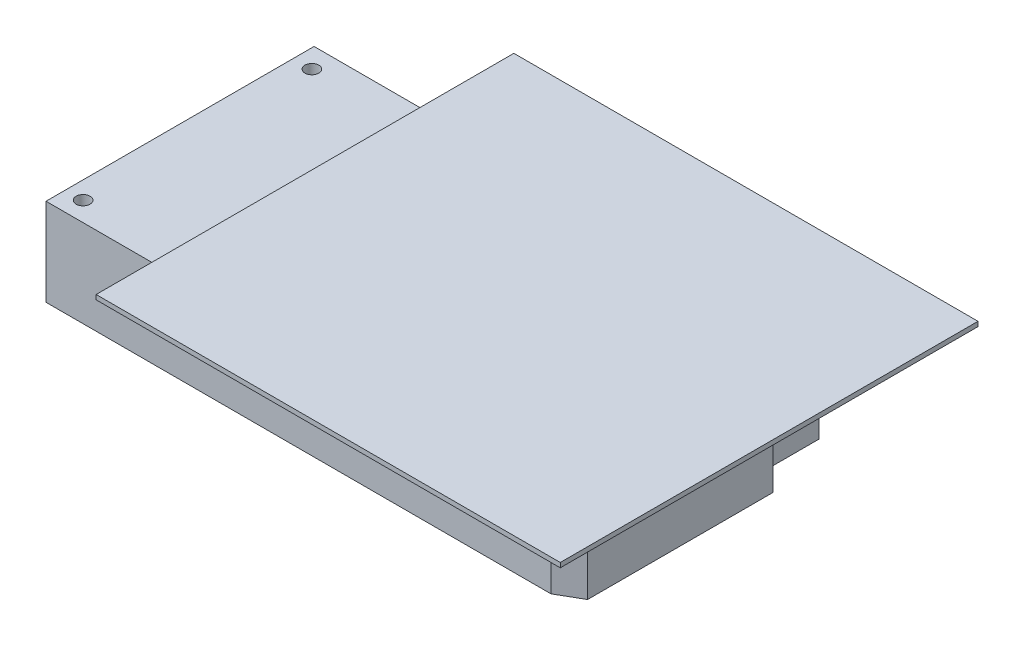
ISO-10303-21;
HEADER;
FILE_DESCRIPTION(('STEP AP214'),'2;1');
FILE_NAME('part.step','',(''),(''),'','','');
FILE_SCHEMA(('AUTOMOTIVE_DESIGN { 1 0 10303 214 1 1 1 1 }'));
ENDSEC;
DATA;
#1=APPLICATION_CONTEXT('core data for automotive mechanical design processes');
#2=APPLICATION_PROTOCOL_DEFINITION('international standard','automotive_design',2000,#1);
#3=PRODUCT_CONTEXT('',#1,'mechanical');
#4=PRODUCT('Part','Part','',(#3));
#5=PRODUCT_RELATED_PRODUCT_CATEGORY('part','',(#4));
#6=PRODUCT_DEFINITION_FORMATION('','',#4);
#7=PRODUCT_DEFINITION_CONTEXT('part definition',#1,'design');
#8=PRODUCT_DEFINITION('design','',#6,#7);
#9=PRODUCT_DEFINITION_SHAPE('','',#8);
#10=(LENGTH_UNIT() NAMED_UNIT(*) SI_UNIT(.MILLI.,.METRE.));
#11=(NAMED_UNIT(*) PLANE_ANGLE_UNIT() SI_UNIT($,.RADIAN.));
#12=(NAMED_UNIT(*) SI_UNIT($,.STERADIAN.) SOLID_ANGLE_UNIT());
#13=UNCERTAINTY_MEASURE_WITH_UNIT(LENGTH_MEASURE(1.E-05),#10,'distance_accuracy_value','');
#14=(GEOMETRIC_REPRESENTATION_CONTEXT(3) GLOBAL_UNCERTAINTY_ASSIGNED_CONTEXT((#13)) GLOBAL_UNIT_ASSIGNED_CONTEXT((#10,
#11,#12)) REPRESENTATION_CONTEXT('',''));
#15=CARTESIAN_POINT('',(0.,0.,0.));
#16=DIRECTION('',(0.,0.,1.));
#17=DIRECTION('',(1.,0.,0.));
#18=AXIS2_PLACEMENT_3D('',#15,#16,#17);
#19=CARTESIAN_POINT('',(0.,18.86,0.));
#20=DIRECTION('',(0.,1.,0.));
#21=DIRECTION('',(0.,0.,1.));
#22=AXIS2_PLACEMENT_3D('',#19,#20,#21);
#23=PLANE('',#22);
#24=DIRECTION('',(0.,0.,1.));
#25=VECTOR('',#24,1.);
#26=CARTESIAN_POINT('',(23.8,18.86,-19.24));
#27=LINE('',#26,#25);
#28=CARTESIAN_POINT('',(23.8,18.86,0.));
#29=VERTEX_POINT('',#28);
#30=CARTESIAN_POINT('',(23.8,18.86,57.7599999999999));
#31=VERTEX_POINT('',#30);
#32=EDGE_CURVE('E11',#29,#31,#27,.T.);
#33=ORIENTED_EDGE('',*,*,#32,.F.);
#34=DIRECTION('',(-1.,0.,0.));
#35=VECTOR('',#34,1.);
#36=CARTESIAN_POINT('',(108.8,18.86,0.));
#37=LINE('',#36,#35);
#38=CARTESIAN_POINT('',(0.,18.86,0.));
#39=VERTEX_POINT('',#38);
#40=EDGE_CURVE('E93',#29,#39,#37,.T.);
#41=ORIENTED_EDGE('',*,*,#40,.T.);
#42=DIRECTION('',(0.,0.,1.));
#43=VECTOR('',#42,1.);
#44=CARTESIAN_POINT('',(0.,18.86,0.));
#45=LINE('',#44,#43);
#46=CARTESIAN_POINT('',(0.,18.86,57.76));
#47=VERTEX_POINT('',#46);
#48=EDGE_CURVE('E168',#39,#47,#45,.T.);
#49=ORIENTED_EDGE('',*,*,#48,.T.);
#50=DIRECTION('',(1.,0.,0.));
#51=VECTOR('',#50,1.);
#52=CARTESIAN_POINT('',(0.,18.86,57.76));
#53=LINE('',#52,#51);
#54=EDGE_CURVE('E134',#47,#31,#53,.T.);
#55=ORIENTED_EDGE('',*,*,#54,.T.);
#56=EDGE_LOOP('',(#33,#41,#49,#55));
#57=FACE_BOUND('',#56,.T.);
#58=CARTESIAN_POINT('',(3.8,18.86,53.57));
#59=DIRECTION('',(0.,1.,0.));
#60=DIRECTION('',(0.,0.,1.));
#61=AXIS2_PLACEMENT_3D('',#58,#59,#60);
#62=CIRCLE('',#61,1.5);
#63=CARTESIAN_POINT('',(3.8,18.86,52.07));
#64=VERTEX_POINT('',#63);
#65=EDGE_CURVE('E199',#64,#64,#62,.T.);
#66=ORIENTED_EDGE('',*,*,#65,.F.);
#67=EDGE_LOOP('',(#66));
#68=FACE_BOUND('',#67,.T.);
#69=CARTESIAN_POINT('',(4.,18.86,4.47));
#70=DIRECTION('',(0.,1.,0.));
#71=DIRECTION('',(0.,0.,1.));
#72=AXIS2_PLACEMENT_3D('',#69,#70,#71);
#73=CIRCLE('',#72,1.5);
#74=CARTESIAN_POINT('',(4.,18.86,2.97));
#75=VERTEX_POINT('',#74);
#76=EDGE_CURVE('E190',#75,#75,#73,.T.);
#77=ORIENTED_EDGE('',*,*,#76,.F.);
#78=EDGE_LOOP('',(#77));
#79=FACE_BOUND('',#78,.T.);
#80=ADVANCED_FACE('F35',(#57,#68,#79),#23,.T.);
#81=CARTESIAN_POINT('',(0.,0.,0.));
#82=DIRECTION('',(0.,1.,0.));
#83=DIRECTION('',(0.,0.,1.));
#84=AXIS2_PLACEMENT_3D('',#81,#82,#83);
#85=PLANE('',#84);
#86=DIRECTION('',(-1.,0.,0.));
#87=VECTOR('',#86,1.);
#88=CARTESIAN_POINT('',(108.8,0.,0.));
#89=LINE('',#88,#87);
#90=CARTESIAN_POINT('',(108.8,0.,0.));
#91=VERTEX_POINT('',#90);
#92=CARTESIAN_POINT('',(0.,0.,0.));
#93=VERTEX_POINT('',#92);
#94=EDGE_CURVE('E139',#91,#93,#89,.T.);
#95=ORIENTED_EDGE('',*,*,#94,.F.);
#96=DIRECTION('',(0.,0.,-1.));
#97=VECTOR('',#96,1.);
#98=CARTESIAN_POINT('',(108.8,0.,12.));
#99=LINE('',#98,#97);
#100=CARTESIAN_POINT('',(108.8,0.,12.));
#101=VERTEX_POINT('',#100);
#102=EDGE_CURVE('E89',#101,#91,#99,.T.);
#103=ORIENTED_EDGE('',*,*,#102,.F.);
#104=DIRECTION('',(-0.86653160609666,0.,-0.499122205111677));
#105=VECTOR('',#104,1.);
#106=CARTESIAN_POINT('',(113.8,0.,14.88));
#107=LINE('',#106,#105);
#108=CARTESIAN_POINT('',(113.8,0.,14.88));
#109=VERTEX_POINT('',#108);
#110=EDGE_CURVE('E150',#109,#101,#107,.T.);
#111=ORIENTED_EDGE('',*,*,#110,.F.);
#112=DIRECTION('',(0.,0.,-1.));
#113=VECTOR('',#112,1.);
#114=CARTESIAN_POINT('',(113.8,0.,54.88));
#115=LINE('',#114,#113);
#116=CARTESIAN_POINT('',(113.8,0.,54.88));
#117=VERTEX_POINT('',#116);
#118=EDGE_CURVE('E116',#117,#109,#115,.T.);
#119=ORIENTED_EDGE('',*,*,#118,.F.);
#120=DIRECTION('',(0.86653160609666,0.,-0.499122205111677));
#121=VECTOR('',#120,1.);
#122=CARTESIAN_POINT('',(108.8,0.,57.76));
#123=LINE('',#122,#121);
#124=CARTESIAN_POINT('',(108.8,0.,57.76));
#125=VERTEX_POINT('',#124);
#126=EDGE_CURVE('E147',#125,#117,#123,.T.);
#127=ORIENTED_EDGE('',*,*,#126,.F.);
#128=DIRECTION('',(1.,0.,0.));
#129=VECTOR('',#128,1.);
#130=CARTESIAN_POINT('',(0.,0.,57.76));
#131=LINE('',#130,#129);
#132=CARTESIAN_POINT('',(0.,0.,57.76));
#133=VERTEX_POINT('',#132);
#134=EDGE_CURVE('E145',#133,#125,#131,.T.);
#135=ORIENTED_EDGE('',*,*,#134,.F.);
#136=DIRECTION('',(0.,0.,1.));
#137=VECTOR('',#136,1.);
#138=CARTESIAN_POINT('',(0.,0.,0.));
#139=LINE('',#138,#137);
#140=EDGE_CURVE('E142',#93,#133,#139,.T.);
#141=ORIENTED_EDGE('',*,*,#140,.F.);
#142=EDGE_LOOP('',(#95,#103,#111,#119,#127,#135,#141));
#143=FACE_BOUND('',#142,.T.);
#144=CARTESIAN_POINT('',(66.5,0.,9.5));
#145=DIRECTION('',(0.,1.,0.));
#146=DIRECTION('',(0.,0.,1.));
#147=AXIS2_PLACEMENT_3D('',#144,#145,#146);
#148=CIRCLE('',#147,1.5);
#149=CARTESIAN_POINT('',(66.5,0.,8.));
#150=VERTEX_POINT('',#149);
#151=EDGE_CURVE('E143',#150,#150,#148,.T.);
#152=ORIENTED_EDGE('',*,*,#151,.T.);
#153=EDGE_LOOP('',(#152));
#154=FACE_BOUND('',#153,.T.);
#155=CARTESIAN_POINT('',(4.,0.,4.47));
#156=DIRECTION('',(0.,1.,0.));
#157=DIRECTION('',(0.,0.,1.));
#158=AXIS2_PLACEMENT_3D('',#155,#156,#157);
#159=CIRCLE('',#158,1.5);
#160=CARTESIAN_POINT('',(4.,0.,2.97));
#161=VERTEX_POINT('',#160);
#162=EDGE_CURVE('E196',#161,#161,#159,.T.);
#163=ORIENTED_EDGE('',*,*,#162,.T.);
#164=EDGE_LOOP('',(#163));
#165=FACE_BOUND('',#164,.T.);
#166=CARTESIAN_POINT('',(3.8,0.,53.57));
#167=DIRECTION('',(0.,1.,0.));
#168=DIRECTION('',(0.,0.,1.));
#169=AXIS2_PLACEMENT_3D('',#166,#167,#168);
#170=CIRCLE('',#169,1.5);
#171=CARTESIAN_POINT('',(3.8,0.,52.07));
#172=VERTEX_POINT('',#171);
#173=EDGE_CURVE('E202',#172,#172,#170,.T.);
#174=ORIENTED_EDGE('',*,*,#173,.T.);
#175=EDGE_LOOP('',(#174));
#176=FACE_BOUND('',#175,.T.);
#177=CARTESIAN_POINT('',(66.5,0.,48.26));
#178=DIRECTION('',(0.,1.,0.));
#179=DIRECTION('',(0.,0.,1.));
#180=AXIS2_PLACEMENT_3D('',#177,#178,#179);
#181=CIRCLE('',#180,1.5);
#182=CARTESIAN_POINT('',(66.5,0.,46.76));
#183=VERTEX_POINT('',#182);
#184=EDGE_CURVE('E194',#183,#183,#181,.T.);
#185=ORIENTED_EDGE('',*,*,#184,.T.);
#186=EDGE_LOOP('',(#185));
#187=FACE_BOUND('',#186,.T.);
#188=ADVANCED_FACE('F172',(#143,#154,#165,#176,#187),#85,.F.);
#189=CARTESIAN_POINT('',(108.8,18.86,0.));
#190=DIRECTION('',(0.,0.,1.));
#191=DIRECTION('',(1.,0.,0.));
#192=AXIS2_PLACEMENT_3D('',#189,#190,#191);
#193=PLANE('',#192);
#194=ORIENTED_EDGE('',*,*,#94,.T.);
#195=DIRECTION('',(0.,-1.,0.));
#196=VECTOR('',#195,1.);
#197=CARTESIAN_POINT('',(0.,18.86,0.));
#198=LINE('',#197,#196);
#199=EDGE_CURVE('E39',#39,#93,#198,.T.);
#200=ORIENTED_EDGE('',*,*,#199,.F.);
#201=ORIENTED_EDGE('',*,*,#40,.F.);
#202=CARTESIAN_POINT('',(108.8,18.86,0.));
#203=VERTEX_POINT('',#202);
#204=EDGE_CURVE('E183',#203,#29,#37,.T.);
#205=ORIENTED_EDGE('',*,*,#204,.F.);
#206=DIRECTION('',(0.,-1.,0.));
#207=VECTOR('',#206,1.);
#208=CARTESIAN_POINT('',(108.8,18.86,0.));
#209=LINE('',#208,#207);
#210=EDGE_CURVE('E60',#203,#91,#209,.T.);
#211=ORIENTED_EDGE('',*,*,#210,.T.);
#212=EDGE_LOOP('',(#194,#200,#201,#205,#211));
#213=FACE_BOUND('',#212,.T.);
#214=ADVANCED_FACE('F37',(#213),#193,.F.);
#215=CARTESIAN_POINT('',(0.,18.86,0.));
#216=DIRECTION('',(1.,0.,0.));
#217=DIRECTION('',(0.,0.,-1.));
#218=AXIS2_PLACEMENT_3D('',#215,#216,#217);
#219=PLANE('',#218);
#220=ORIENTED_EDGE('',*,*,#140,.T.);
#221=DIRECTION('',(0.,-1.,0.));
#222=VECTOR('',#221,1.);
#223=CARTESIAN_POINT('',(0.,18.86,57.76));
#224=LINE('',#223,#222);
#225=EDGE_CURVE('E158',#47,#133,#224,.T.);
#226=ORIENTED_EDGE('',*,*,#225,.F.);
#227=ORIENTED_EDGE('',*,*,#48,.F.);
#228=ORIENTED_EDGE('',*,*,#199,.T.);
#229=EDGE_LOOP('',(#220,#226,#227,#228));
#230=FACE_BOUND('',#229,.T.);
#231=ADVANCED_FACE('F167',(#230),#219,.F.);
#232=CARTESIAN_POINT('',(0.,18.86,57.76));
#233=DIRECTION('',(0.,0.,-1.));
#234=DIRECTION('',(-1.,0.,0.));
#235=AXIS2_PLACEMENT_3D('',#232,#233,#234);
#236=PLANE('',#235);
#237=ORIENTED_EDGE('',*,*,#134,.T.);
#238=DIRECTION('',(0.,-1.,0.));
#239=VECTOR('',#238,1.);
#240=CARTESIAN_POINT('',(108.8,18.86,57.76));
#241=LINE('',#240,#239);
#242=CARTESIAN_POINT('',(108.8,18.86,57.76));
#243=VERTEX_POINT('',#242);
#244=EDGE_CURVE('E156',#243,#125,#241,.T.);
#245=ORIENTED_EDGE('',*,*,#244,.F.);
#246=EDGE_CURVE('E180',#31,#243,#53,.T.);
#247=ORIENTED_EDGE('',*,*,#246,.F.);
#248=ORIENTED_EDGE('',*,*,#54,.F.);
#249=ORIENTED_EDGE('',*,*,#225,.T.);
#250=EDGE_LOOP('',(#237,#245,#247,#248,#249));
#251=FACE_BOUND('',#250,.T.);
#252=ADVANCED_FACE('F175',(#251),#236,.F.);
#253=CARTESIAN_POINT('',(108.8,18.86,57.76));
#254=DIRECTION('',(-0.499122205111677,0.,-0.86653160609666));
#255=DIRECTION('',(-0.86653160609666,0.,0.499122205111677));
#256=AXIS2_PLACEMENT_3D('',#253,#254,#255);
#257=PLANE('',#256);
#258=ORIENTED_EDGE('',*,*,#126,.T.);
#259=DIRECTION('',(0.,-1.,0.));
#260=VECTOR('',#259,1.);
#261=CARTESIAN_POINT('',(113.8,18.86,54.88));
#262=LINE('',#261,#260);
#263=CARTESIAN_POINT('',(113.8,18.86,54.88));
#264=VERTEX_POINT('',#263);
#265=EDGE_CURVE('E119',#264,#117,#262,.T.);
#266=ORIENTED_EDGE('',*,*,#265,.F.);
#267=DIRECTION('',(0.86653160609666,0.,-0.499122205111677));
#268=VECTOR('',#267,1.);
#269=CARTESIAN_POINT('',(108.8,18.86,57.76));
#270=LINE('',#269,#268);
#271=EDGE_CURVE('E132',#243,#264,#270,.T.);
#272=ORIENTED_EDGE('',*,*,#271,.F.);
#273=ORIENTED_EDGE('',*,*,#244,.T.);
#274=EDGE_LOOP('',(#258,#266,#272,#273));
#275=FACE_BOUND('',#274,.T.);
#276=ADVANCED_FACE('F178',(#275),#257,.F.);
#277=CARTESIAN_POINT('',(113.8,18.86,54.88));
#278=DIRECTION('',(-1.,0.,0.));
#279=DIRECTION('',(0.,0.,1.));
#280=AXIS2_PLACEMENT_3D('',#277,#278,#279);
#281=PLANE('',#280);
#282=ORIENTED_EDGE('',*,*,#118,.T.);
#283=DIRECTION('',(0.,-1.,0.));
#284=VECTOR('',#283,1.);
#285=CARTESIAN_POINT('',(113.8,18.86,14.88));
#286=LINE('',#285,#284);
#287=CARTESIAN_POINT('',(113.8,18.86,14.88));
#288=VERTEX_POINT('',#287);
#289=EDGE_CURVE('E108',#288,#109,#286,.T.);
#290=ORIENTED_EDGE('',*,*,#289,.F.);
#291=DIRECTION('',(0.,0.,-1.));
#292=VECTOR('',#291,1.);
#293=CARTESIAN_POINT('',(113.8,18.86,54.88));
#294=LINE('',#293,#292);
#295=EDGE_CURVE('E113',#264,#288,#294,.T.);
#296=ORIENTED_EDGE('',*,*,#295,.F.);
#297=ORIENTED_EDGE('',*,*,#265,.T.);
#298=EDGE_LOOP('',(#282,#290,#296,#297));
#299=FACE_BOUND('',#298,.T.);
#300=ADVANCED_FACE('F110',(#299),#281,.F.);
#301=CARTESIAN_POINT('',(113.8,18.86,14.88));
#302=DIRECTION('',(-0.499122205111677,0.,0.86653160609666));
#303=DIRECTION('',(0.86653160609666,0.,0.499122205111677));
#304=AXIS2_PLACEMENT_3D('',#301,#302,#303);
#305=PLANE('',#304);
#306=ORIENTED_EDGE('',*,*,#110,.T.);
#307=DIRECTION('',(0.,-1.,0.));
#308=VECTOR('',#307,1.);
#309=CARTESIAN_POINT('',(108.8,18.86,12.));
#310=LINE('',#309,#308);
#311=CARTESIAN_POINT('',(108.8,18.86,12.));
#312=VERTEX_POINT('',#311);
#313=EDGE_CURVE('E120',#312,#101,#310,.T.);
#314=ORIENTED_EDGE('',*,*,#313,.F.);
#315=DIRECTION('',(-0.86653160609666,0.,-0.499122205111677));
#316=VECTOR('',#315,1.);
#317=CARTESIAN_POINT('',(113.8,18.86,14.88));
#318=LINE('',#317,#316);
#319=EDGE_CURVE('E123',#288,#312,#318,.T.);
#320=ORIENTED_EDGE('',*,*,#319,.F.);
#321=ORIENTED_EDGE('',*,*,#289,.T.);
#322=EDGE_LOOP('',(#306,#314,#320,#321));
#323=FACE_BOUND('',#322,.T.);
#324=ADVANCED_FACE('F124',(#323),#305,.F.);
#325=CARTESIAN_POINT('',(108.8,18.86,12.));
#326=DIRECTION('',(-1.,0.,0.));
#327=DIRECTION('',(0.,0.,1.));
#328=AXIS2_PLACEMENT_3D('',#325,#326,#327);
#329=PLANE('',#328);
#330=ORIENTED_EDGE('',*,*,#102,.T.);
#331=ORIENTED_EDGE('',*,*,#210,.F.);
#332=DIRECTION('',(0.,0.,-1.));
#333=VECTOR('',#332,1.);
#334=CARTESIAN_POINT('',(108.8,18.86,12.));
#335=LINE('',#334,#333);
#336=EDGE_CURVE('E127',#312,#203,#335,.T.);
#337=ORIENTED_EDGE('',*,*,#336,.F.);
#338=ORIENTED_EDGE('',*,*,#313,.T.);
#339=EDGE_LOOP('',(#330,#331,#337,#338));
#340=FACE_BOUND('',#339,.T.);
#341=ADVANCED_FACE('F275',(#340),#329,.F.);
#342=CARTESIAN_POINT('',(66.5,18.86,9.5));
#343=DIRECTION('',(0.,-1.,0.));
#344=DIRECTION('',(0.,0.,-1.));
#345=AXIS2_PLACEMENT_3D('',#342,#343,#344);
#346=CYLINDRICAL_SURFACE('',#345,1.5);
#347=CARTESIAN_POINT('',(66.5,18.86,9.5));
#348=DIRECTION('',(0.,1.,0.));
#349=DIRECTION('',(0.,0.,1.));
#350=AXIS2_PLACEMENT_3D('',#347,#348,#349);
#351=CIRCLE('',#350,1.5);
#352=CARTESIAN_POINT('',(66.5,18.86,8.));
#353=VERTEX_POINT('',#352);
#354=EDGE_CURVE('E191',#353,#353,#351,.T.);
#355=CARTESIAN_POINT('',(66.5,18.86,8.));
#356=CARTESIAN_POINT('',(66.5,18.6635416666667,8.));
#357=CARTESIAN_POINT('',(66.5,18.4670833333333,8.));
#358=CARTESIAN_POINT('',(66.5,18.0741666666667,8.));
#359=CARTESIAN_POINT('',(66.5,17.8777083333333,8.));
#360=CARTESIAN_POINT('',(66.5,17.4847916666667,8.));
#361=CARTESIAN_POINT('',(66.5,17.2883333333333,8.));
#362=CARTESIAN_POINT('',(66.5,16.8954166666667,8.));
#363=CARTESIAN_POINT('',(66.5,16.6989583333333,8.));
#364=CARTESIAN_POINT('',(66.5,16.3060416666667,8.));
#365=CARTESIAN_POINT('',(66.5,16.1095833333333,8.));
#366=CARTESIAN_POINT('',(66.5,15.7166666666667,8.));
#367=CARTESIAN_POINT('',(66.5,15.5202083333333,8.));
#368=CARTESIAN_POINT('',(66.5,15.1272916666667,8.));
#369=CARTESIAN_POINT('',(66.5,14.9308333333333,8.));
#370=CARTESIAN_POINT('',(66.5,14.5379166666667,8.));
#371=CARTESIAN_POINT('',(66.5,14.3414583333333,8.));
#372=CARTESIAN_POINT('',(66.5,13.9485416666667,8.));
#373=CARTESIAN_POINT('',(66.5,13.7520833333333,8.));
#374=CARTESIAN_POINT('',(66.5,13.3591666666667,8.));
#375=CARTESIAN_POINT('',(66.5,13.1627083333333,8.));
#376=CARTESIAN_POINT('',(66.5,12.7697916666667,8.));
#377=CARTESIAN_POINT('',(66.5,12.5733333333333,8.));
#378=CARTESIAN_POINT('',(66.5,12.1804166666667,8.));
#379=CARTESIAN_POINT('',(66.5,11.9839583333333,8.));
#380=CARTESIAN_POINT('',(66.5,11.5910416666667,8.));
#381=CARTESIAN_POINT('',(66.5,11.3945833333333,8.));
#382=CARTESIAN_POINT('',(66.5,11.0016666666667,8.));
#383=CARTESIAN_POINT('',(66.5,10.8052083333333,8.));
#384=CARTESIAN_POINT('',(66.5,10.4122916666667,8.));
#385=CARTESIAN_POINT('',(66.5,10.2158333333333,8.));
#386=CARTESIAN_POINT('',(66.5,9.82291666666667,8.));
#387=CARTESIAN_POINT('',(66.5,9.62645833333333,8.));
#388=CARTESIAN_POINT('',(66.5,9.23354166666667,8.));
#389=CARTESIAN_POINT('',(66.5,9.03708333333333,8.));
#390=CARTESIAN_POINT('',(66.5,8.64416666666667,8.));
#391=CARTESIAN_POINT('',(66.5,8.44770833333333,8.));
#392=CARTESIAN_POINT('',(66.5,8.05479166666667,8.));
#393=CARTESIAN_POINT('',(66.5,7.85833333333333,8.));
#394=CARTESIAN_POINT('',(66.5,7.46541666666667,8.));
#395=CARTESIAN_POINT('',(66.5,7.26895833333333,8.));
#396=CARTESIAN_POINT('',(66.5,6.87604166666667,8.));
#397=CARTESIAN_POINT('',(66.5,6.67958333333333,8.));
#398=CARTESIAN_POINT('',(66.5,6.28666666666667,8.));
#399=CARTESIAN_POINT('',(66.5,6.09020833333333,8.));
#400=CARTESIAN_POINT('',(66.5,5.69729166666667,8.));
#401=CARTESIAN_POINT('',(66.5,5.50083333333333,8.));
#402=CARTESIAN_POINT('',(66.5,5.10791666666667,8.));
#403=CARTESIAN_POINT('',(66.5,4.91145833333333,8.));
#404=CARTESIAN_POINT('',(66.5,4.51854166666667,8.));
#405=CARTESIAN_POINT('',(66.5,4.32208333333333,8.));
#406=CARTESIAN_POINT('',(66.5,3.92916666666667,8.));
#407=CARTESIAN_POINT('',(66.5,3.73270833333333,8.));
#408=CARTESIAN_POINT('',(66.5,3.33979166666667,8.));
#409=CARTESIAN_POINT('',(66.5,3.14333333333333,8.));
#410=CARTESIAN_POINT('',(66.5,2.75041666666666,8.));
#411=CARTESIAN_POINT('',(66.5,2.55395833333333,8.));
#412=CARTESIAN_POINT('',(66.5,2.16104166666667,8.));
#413=CARTESIAN_POINT('',(66.5,1.96458333333333,8.));
#414=CARTESIAN_POINT('',(66.5,1.57166666666667,8.));
#415=CARTESIAN_POINT('',(66.5,1.37520833333333,8.));
#416=CARTESIAN_POINT('',(66.5,0.982291666666666,8.));
#417=CARTESIAN_POINT('',(66.5,0.785833333333333,8.));
#418=CARTESIAN_POINT('',(66.5,0.392916666666666,8.));
#419=CARTESIAN_POINT('',(66.5,0.196458333333333,8.));
#420=CARTESIAN_POINT('',(66.5,0.,8.));
#421=B_SPLINE_CURVE_WITH_KNOTS('',3,(#355,#356,#357,#358,#359,#360,#361,#362,#363,#364,#365,
#366,#367,#368,#369,#370,#371,#372,#373,#374,#375,#376,#377,#378,#379,#380,#381,#382,#383,#384,
#385,#386,#387,#388,#389,#390,#391,#392,#393,#394,#395,#396,#397,#398,#399,#400,#401,#402,#403,
#404,#405,#406,#407,#408,#409,#410,#411,#412,#413,#414,#415,#416,#417,#418,#419,#420),
.UNSPECIFIED.,.F.,.F.,(4,2,2,2,2,2,2,2,2,2,2,2,2,2,2,2,2,2,2,2,2,2,2,2,2,2,2,2,2,2,2,2,4),(0.,
0.589375,1.17875,1.768125,2.3575,2.946875,3.53625,4.125625,4.715,5.304375,5.89375,6.483125,
7.0725,7.661875,8.25125,8.840625,9.43,10.019375,10.60875,11.198125,11.7875,12.376875,12.96625,
13.555625,14.145,14.734375,15.32375,15.913125,16.5025,17.091875,17.68125,18.270625,18.86),.UNSPECIFIED.);
#422=EDGE_CURVE('BSEAM277',#353,#150,#421,.T.);
#423=ORIENTED_EDGE('',*,*,#354,.T.);
#424=ORIENTED_EDGE('',*,*,#151,.F.);
#425=ORIENTED_EDGE('',*,*,#422,.T.);
#426=ORIENTED_EDGE('',*,*,#422,.F.);
#427=EDGE_LOOP('',(#423,#425,#424,#426));
#428=FACE_BOUND('',#427,.T.);
#429=ADVANCED_FACE('F277',(#428),#346,.F.);
#430=CARTESIAN_POINT('',(4.,18.86,4.47));
#431=DIRECTION('',(0.,-1.,0.));
#432=DIRECTION('',(0.,0.,-1.));
#433=AXIS2_PLACEMENT_3D('',#430,#431,#432);
#434=CYLINDRICAL_SURFACE('',#433,1.5);
#435=CARTESIAN_POINT('',(4.,18.86,2.97));
#436=CARTESIAN_POINT('',(4.,18.6635416666667,2.97));
#437=CARTESIAN_POINT('',(4.,18.4670833333333,2.97));
#438=CARTESIAN_POINT('',(4.,18.0741666666667,2.97));
#439=CARTESIAN_POINT('',(4.,17.8777083333333,2.97));
#440=CARTESIAN_POINT('',(4.,17.4847916666667,2.97));
#441=CARTESIAN_POINT('',(4.,17.2883333333333,2.97));
#442=CARTESIAN_POINT('',(4.,16.8954166666667,2.97));
#443=CARTESIAN_POINT('',(4.,16.6989583333333,2.97));
#444=CARTESIAN_POINT('',(4.,16.3060416666667,2.97));
#445=CARTESIAN_POINT('',(4.,16.1095833333333,2.97));
#446=CARTESIAN_POINT('',(4.,15.7166666666667,2.97));
#447=CARTESIAN_POINT('',(4.,15.5202083333333,2.97));
#448=CARTESIAN_POINT('',(4.,15.1272916666667,2.97));
#449=CARTESIAN_POINT('',(4.,14.9308333333333,2.97));
#450=CARTESIAN_POINT('',(4.,14.5379166666667,2.97));
#451=CARTESIAN_POINT('',(4.,14.3414583333333,2.97));
#452=CARTESIAN_POINT('',(4.,13.9485416666667,2.97));
#453=CARTESIAN_POINT('',(4.,13.7520833333333,2.97));
#454=CARTESIAN_POINT('',(4.,13.3591666666667,2.97));
#455=CARTESIAN_POINT('',(4.,13.1627083333333,2.97));
#456=CARTESIAN_POINT('',(4.,12.7697916666667,2.97));
#457=CARTESIAN_POINT('',(4.,12.5733333333333,2.97));
#458=CARTESIAN_POINT('',(4.,12.1804166666667,2.97));
#459=CARTESIAN_POINT('',(4.,11.9839583333333,2.97));
#460=CARTESIAN_POINT('',(4.,11.5910416666667,2.97));
#461=CARTESIAN_POINT('',(4.,11.3945833333333,2.97));
#462=CARTESIAN_POINT('',(4.,11.0016666666667,2.97));
#463=CARTESIAN_POINT('',(4.,10.8052083333333,2.97));
#464=CARTESIAN_POINT('',(4.,10.4122916666667,2.97));
#465=CARTESIAN_POINT('',(4.,10.2158333333333,2.97));
#466=CARTESIAN_POINT('',(4.,9.82291666666667,2.97));
#467=CARTESIAN_POINT('',(4.,9.62645833333333,2.97));
#468=CARTESIAN_POINT('',(4.,9.23354166666667,2.97));
#469=CARTESIAN_POINT('',(4.,9.03708333333333,2.97));
#470=CARTESIAN_POINT('',(4.,8.64416666666667,2.97));
#471=CARTESIAN_POINT('',(4.,8.44770833333333,2.97));
#472=CARTESIAN_POINT('',(4.,8.05479166666667,2.97));
#473=CARTESIAN_POINT('',(4.,7.85833333333333,2.97));
#474=CARTESIAN_POINT('',(4.,7.46541666666667,2.97));
#475=CARTESIAN_POINT('',(4.,7.26895833333333,2.97));
#476=CARTESIAN_POINT('',(4.,6.87604166666667,2.97));
#477=CARTESIAN_POINT('',(4.,6.67958333333333,2.97));
#478=CARTESIAN_POINT('',(4.,6.28666666666667,2.97));
#479=CARTESIAN_POINT('',(4.,6.09020833333333,2.97));
#480=CARTESIAN_POINT('',(4.,5.69729166666667,2.97));
#481=CARTESIAN_POINT('',(4.,5.50083333333333,2.97));
#482=CARTESIAN_POINT('',(4.,5.10791666666667,2.97));
#483=CARTESIAN_POINT('',(4.,4.91145833333333,2.97));
#484=CARTESIAN_POINT('',(4.,4.51854166666667,2.97));
#485=CARTESIAN_POINT('',(4.,4.32208333333333,2.97));
#486=CARTESIAN_POINT('',(4.,3.92916666666667,2.97));
#487=CARTESIAN_POINT('',(4.,3.73270833333333,2.97));
#488=CARTESIAN_POINT('',(4.,3.33979166666667,2.97));
#489=CARTESIAN_POINT('',(4.,3.14333333333333,2.97));
#490=CARTESIAN_POINT('',(4.,2.75041666666666,2.97));
#491=CARTESIAN_POINT('',(4.,2.55395833333333,2.97));
#492=CARTESIAN_POINT('',(4.,2.16104166666667,2.97));
#493=CARTESIAN_POINT('',(4.,1.96458333333333,2.97));
#494=CARTESIAN_POINT('',(4.,1.57166666666667,2.97));
#495=CARTESIAN_POINT('',(4.,1.37520833333333,2.97));
#496=CARTESIAN_POINT('',(4.,0.982291666666666,2.97));
#497=CARTESIAN_POINT('',(4.,0.785833333333333,2.97));
#498=CARTESIAN_POINT('',(4.,0.392916666666666,2.97));
#499=CARTESIAN_POINT('',(4.,0.196458333333333,2.97));
#500=CARTESIAN_POINT('',(4.,0.,2.97));
#501=B_SPLINE_CURVE_WITH_KNOTS('',3,(#435,#436,#437,#438,#439,#440,#441,#442,#443,#444,#445,
#446,#447,#448,#449,#450,#451,#452,#453,#454,#455,#456,#457,#458,#459,#460,#461,#462,#463,#464,
#465,#466,#467,#468,#469,#470,#471,#472,#473,#474,#475,#476,#477,#478,#479,#480,#481,#482,#483,
#484,#485,#486,#487,#488,#489,#490,#491,#492,#493,#494,#495,#496,#497,#498,#499,#500),
.UNSPECIFIED.,.F.,.F.,(4,2,2,2,2,2,2,2,2,2,2,2,2,2,2,2,2,2,2,2,2,2,2,2,2,2,2,2,2,2,2,2,4),(0.,
0.589375,1.17875,1.768125,2.3575,2.946875,3.53625,4.125625,4.715,5.304375,5.89375,6.483125,
7.0725,7.661875,8.25125,8.840625,9.43,10.019375,10.60875,11.198125,11.7875,12.376875,12.96625,
13.555625,14.145,14.734375,15.32375,15.913125,16.5025,17.091875,17.68125,18.270625,18.86),.UNSPECIFIED.);
#502=EDGE_CURVE('BSEAM283',#75,#161,#501,.T.);
#503=ORIENTED_EDGE('',*,*,#76,.T.);
#504=ORIENTED_EDGE('',*,*,#162,.F.);
#505=ORIENTED_EDGE('',*,*,#502,.T.);
#506=ORIENTED_EDGE('',*,*,#502,.F.);
#507=EDGE_LOOP('',(#503,#505,#504,#506));
#508=FACE_BOUND('',#507,.T.);
#509=ADVANCED_FACE('F283',(#508),#434,.F.);
#510=CARTESIAN_POINT('',(3.8,18.86,53.57));
#511=DIRECTION('',(0.,-1.,0.));
#512=DIRECTION('',(0.,0.,-1.));
#513=AXIS2_PLACEMENT_3D('',#510,#511,#512);
#514=CYLINDRICAL_SURFACE('',#513,1.5);
#515=CARTESIAN_POINT('',(3.8,18.86,52.07));
#516=CARTESIAN_POINT('',(3.8,18.6635416666667,52.07));
#517=CARTESIAN_POINT('',(3.8,18.4670833333333,52.07));
#518=CARTESIAN_POINT('',(3.8,18.0741666666667,52.07));
#519=CARTESIAN_POINT('',(3.8,17.8777083333333,52.07));
#520=CARTESIAN_POINT('',(3.8,17.4847916666667,52.07));
#521=CARTESIAN_POINT('',(3.8,17.2883333333333,52.07));
#522=CARTESIAN_POINT('',(3.8,16.8954166666667,52.07));
#523=CARTESIAN_POINT('',(3.8,16.6989583333333,52.07));
#524=CARTESIAN_POINT('',(3.8,16.3060416666667,52.07));
#525=CARTESIAN_POINT('',(3.8,16.1095833333333,52.07));
#526=CARTESIAN_POINT('',(3.8,15.7166666666667,52.07));
#527=CARTESIAN_POINT('',(3.8,15.5202083333333,52.07));
#528=CARTESIAN_POINT('',(3.8,15.1272916666667,52.07));
#529=CARTESIAN_POINT('',(3.8,14.9308333333333,52.07));
#530=CARTESIAN_POINT('',(3.8,14.5379166666667,52.07));
#531=CARTESIAN_POINT('',(3.8,14.3414583333333,52.07));
#532=CARTESIAN_POINT('',(3.8,13.9485416666667,52.07));
#533=CARTESIAN_POINT('',(3.8,13.7520833333333,52.07));
#534=CARTESIAN_POINT('',(3.8,13.3591666666667,52.07));
#535=CARTESIAN_POINT('',(3.8,13.1627083333333,52.07));
#536=CARTESIAN_POINT('',(3.8,12.7697916666667,52.07));
#537=CARTESIAN_POINT('',(3.8,12.5733333333333,52.07));
#538=CARTESIAN_POINT('',(3.8,12.1804166666667,52.07));
#539=CARTESIAN_POINT('',(3.8,11.9839583333333,52.07));
#540=CARTESIAN_POINT('',(3.8,11.5910416666667,52.07));
#541=CARTESIAN_POINT('',(3.8,11.3945833333333,52.07));
#542=CARTESIAN_POINT('',(3.8,11.0016666666667,52.07));
#543=CARTESIAN_POINT('',(3.8,10.8052083333333,52.07));
#544=CARTESIAN_POINT('',(3.8,10.4122916666667,52.07));
#545=CARTESIAN_POINT('',(3.8,10.2158333333333,52.07));
#546=CARTESIAN_POINT('',(3.8,9.82291666666667,52.07));
#547=CARTESIAN_POINT('',(3.8,9.62645833333333,52.07));
#548=CARTESIAN_POINT('',(3.8,9.23354166666667,52.07));
#549=CARTESIAN_POINT('',(3.8,9.03708333333333,52.07));
#550=CARTESIAN_POINT('',(3.8,8.64416666666667,52.07));
#551=CARTESIAN_POINT('',(3.8,8.44770833333333,52.07));
#552=CARTESIAN_POINT('',(3.8,8.05479166666667,52.07));
#553=CARTESIAN_POINT('',(3.8,7.85833333333333,52.07));
#554=CARTESIAN_POINT('',(3.8,7.46541666666667,52.07));
#555=CARTESIAN_POINT('',(3.8,7.26895833333333,52.07));
#556=CARTESIAN_POINT('',(3.8,6.87604166666667,52.07));
#557=CARTESIAN_POINT('',(3.8,6.67958333333333,52.07));
#558=CARTESIAN_POINT('',(3.8,6.28666666666667,52.07));
#559=CARTESIAN_POINT('',(3.8,6.09020833333333,52.07));
#560=CARTESIAN_POINT('',(3.8,5.69729166666667,52.07));
#561=CARTESIAN_POINT('',(3.8,5.50083333333333,52.07));
#562=CARTESIAN_POINT('',(3.8,5.10791666666667,52.07));
#563=CARTESIAN_POINT('',(3.8,4.91145833333333,52.07));
#564=CARTESIAN_POINT('',(3.8,4.51854166666667,52.07));
#565=CARTESIAN_POINT('',(3.8,4.32208333333333,52.07));
#566=CARTESIAN_POINT('',(3.8,3.92916666666667,52.07));
#567=CARTESIAN_POINT('',(3.8,3.73270833333333,52.07));
#568=CARTESIAN_POINT('',(3.8,3.33979166666667,52.07));
#569=CARTESIAN_POINT('',(3.8,3.14333333333333,52.07));
#570=CARTESIAN_POINT('',(3.8,2.75041666666666,52.07));
#571=CARTESIAN_POINT('',(3.8,2.55395833333333,52.07));
#572=CARTESIAN_POINT('',(3.8,2.16104166666667,52.07));
#573=CARTESIAN_POINT('',(3.8,1.96458333333333,52.07));
#574=CARTESIAN_POINT('',(3.8,1.57166666666667,52.07));
#575=CARTESIAN_POINT('',(3.8,1.37520833333333,52.07));
#576=CARTESIAN_POINT('',(3.8,0.982291666666666,52.07));
#577=CARTESIAN_POINT('',(3.8,0.785833333333333,52.07));
#578=CARTESIAN_POINT('',(3.8,0.392916666666666,52.07));
#579=CARTESIAN_POINT('',(3.8,0.196458333333333,52.07));
#580=CARTESIAN_POINT('',(3.8,0.,52.07));
#581=B_SPLINE_CURVE_WITH_KNOTS('',3,(#515,#516,#517,#518,#519,#520,#521,#522,#523,#524,#525,
#526,#527,#528,#529,#530,#531,#532,#533,#534,#535,#536,#537,#538,#539,#540,#541,#542,#543,#544,
#545,#546,#547,#548,#549,#550,#551,#552,#553,#554,#555,#556,#557,#558,#559,#560,#561,#562,#563,
#564,#565,#566,#567,#568,#569,#570,#571,#572,#573,#574,#575,#576,#577,#578,#579,#580),
.UNSPECIFIED.,.F.,.F.,(4,2,2,2,2,2,2,2,2,2,2,2,2,2,2,2,2,2,2,2,2,2,2,2,2,2,2,2,2,2,2,2,4),(0.,
0.589375,1.17875,1.768125,2.3575,2.946875,3.53625,4.125625,4.715,5.304375,5.89375,6.483125,
7.0725,7.661875,8.25125,8.840625,9.43,10.019375,10.60875,11.198125,11.7875,12.376875,12.96625,
13.555625,14.145,14.734375,15.32375,15.913125,16.5025,17.091875,17.68125,18.270625,18.86),.UNSPECIFIED.);
#582=EDGE_CURVE('BSEAM297',#64,#172,#581,.T.);
#583=ORIENTED_EDGE('',*,*,#65,.T.);
#584=ORIENTED_EDGE('',*,*,#173,.F.);
#585=ORIENTED_EDGE('',*,*,#582,.T.);
#586=ORIENTED_EDGE('',*,*,#582,.F.);
#587=EDGE_LOOP('',(#583,#585,#584,#586));
#588=FACE_BOUND('',#587,.T.);
#589=ADVANCED_FACE('F297',(#588),#514,.F.);
#590=CARTESIAN_POINT('',(66.5,18.86,48.26));
#591=DIRECTION('',(0.,-1.,0.));
#592=DIRECTION('',(0.,0.,-1.));
#593=AXIS2_PLACEMENT_3D('',#590,#591,#592);
#594=CYLINDRICAL_SURFACE('',#593,1.5);
#595=CARTESIAN_POINT('',(66.5,18.86,48.26));
#596=DIRECTION('',(0.,1.,0.));
#597=DIRECTION('',(0.,0.,1.));
#598=AXIS2_PLACEMENT_3D('',#595,#596,#597);
#599=CIRCLE('',#598,1.5);
#600=CARTESIAN_POINT('',(66.5,18.86,46.76));
#601=VERTEX_POINT('',#600);
#602=EDGE_CURVE('E195',#601,#601,#599,.T.);
#603=CARTESIAN_POINT('',(66.5,18.86,46.76));
#604=CARTESIAN_POINT('',(66.5,18.6635416666667,46.76));
#605=CARTESIAN_POINT('',(66.5,18.4670833333333,46.76));
#606=CARTESIAN_POINT('',(66.5,18.0741666666667,46.76));
#607=CARTESIAN_POINT('',(66.5,17.8777083333333,46.76));
#608=CARTESIAN_POINT('',(66.5,17.4847916666667,46.76));
#609=CARTESIAN_POINT('',(66.5,17.2883333333333,46.76));
#610=CARTESIAN_POINT('',(66.5,16.8954166666667,46.76));
#611=CARTESIAN_POINT('',(66.5,16.6989583333333,46.76));
#612=CARTESIAN_POINT('',(66.5,16.3060416666667,46.76));
#613=CARTESIAN_POINT('',(66.5,16.1095833333333,46.76));
#614=CARTESIAN_POINT('',(66.5,15.7166666666667,46.76));
#615=CARTESIAN_POINT('',(66.5,15.5202083333333,46.76));
#616=CARTESIAN_POINT('',(66.5,15.1272916666667,46.76));
#617=CARTESIAN_POINT('',(66.5,14.9308333333333,46.76));
#618=CARTESIAN_POINT('',(66.5,14.5379166666667,46.76));
#619=CARTESIAN_POINT('',(66.5,14.3414583333333,46.76));
#620=CARTESIAN_POINT('',(66.5,13.9485416666667,46.76));
#621=CARTESIAN_POINT('',(66.5,13.7520833333333,46.76));
#622=CARTESIAN_POINT('',(66.5,13.3591666666667,46.76));
#623=CARTESIAN_POINT('',(66.5,13.1627083333333,46.76));
#624=CARTESIAN_POINT('',(66.5,12.7697916666667,46.76));
#625=CARTESIAN_POINT('',(66.5,12.5733333333333,46.76));
#626=CARTESIAN_POINT('',(66.5,12.1804166666667,46.76));
#627=CARTESIAN_POINT('',(66.5,11.9839583333333,46.76));
#628=CARTESIAN_POINT('',(66.5,11.5910416666667,46.76));
#629=CARTESIAN_POINT('',(66.5,11.3945833333333,46.76));
#630=CARTESIAN_POINT('',(66.5,11.0016666666667,46.76));
#631=CARTESIAN_POINT('',(66.5,10.8052083333333,46.76));
#632=CARTESIAN_POINT('',(66.5,10.4122916666667,46.76));
#633=CARTESIAN_POINT('',(66.5,10.2158333333333,46.76));
#634=CARTESIAN_POINT('',(66.5,9.82291666666667,46.76));
#635=CARTESIAN_POINT('',(66.5,9.62645833333333,46.76));
#636=CARTESIAN_POINT('',(66.5,9.23354166666667,46.76));
#637=CARTESIAN_POINT('',(66.5,9.03708333333333,46.76));
#638=CARTESIAN_POINT('',(66.5,8.64416666666667,46.76));
#639=CARTESIAN_POINT('',(66.5,8.44770833333333,46.76));
#640=CARTESIAN_POINT('',(66.5,8.05479166666667,46.76));
#641=CARTESIAN_POINT('',(66.5,7.85833333333333,46.76));
#642=CARTESIAN_POINT('',(66.5,7.46541666666667,46.76));
#643=CARTESIAN_POINT('',(66.5,7.26895833333333,46.76));
#644=CARTESIAN_POINT('',(66.5,6.87604166666667,46.76));
#645=CARTESIAN_POINT('',(66.5,6.67958333333333,46.76));
#646=CARTESIAN_POINT('',(66.5,6.28666666666667,46.76));
#647=CARTESIAN_POINT('',(66.5,6.09020833333333,46.76));
#648=CARTESIAN_POINT('',(66.5,5.69729166666667,46.76));
#649=CARTESIAN_POINT('',(66.5,5.50083333333333,46.76));
#650=CARTESIAN_POINT('',(66.5,5.10791666666667,46.76));
#651=CARTESIAN_POINT('',(66.5,4.91145833333333,46.76));
#652=CARTESIAN_POINT('',(66.5,4.51854166666667,46.76));
#653=CARTESIAN_POINT('',(66.5,4.32208333333333,46.76));
#654=CARTESIAN_POINT('',(66.5,3.92916666666667,46.76));
#655=CARTESIAN_POINT('',(66.5,3.73270833333333,46.76));
#656=CARTESIAN_POINT('',(66.5,3.33979166666667,46.76));
#657=CARTESIAN_POINT('',(66.5,3.14333333333333,46.76));
#658=CARTESIAN_POINT('',(66.5,2.75041666666666,46.76));
#659=CARTESIAN_POINT('',(66.5,2.55395833333333,46.76));
#660=CARTESIAN_POINT('',(66.5,2.16104166666667,46.76));
#661=CARTESIAN_POINT('',(66.5,1.96458333333333,46.76));
#662=CARTESIAN_POINT('',(66.5,1.57166666666667,46.76));
#663=CARTESIAN_POINT('',(66.5,1.37520833333333,46.76));
#664=CARTESIAN_POINT('',(66.5,0.982291666666666,46.76));
#665=CARTESIAN_POINT('',(66.5,0.785833333333333,46.76));
#666=CARTESIAN_POINT('',(66.5,0.392916666666666,46.76));
#667=CARTESIAN_POINT('',(66.5,0.196458333333333,46.76));
#668=CARTESIAN_POINT('',(66.5,0.,46.76));
#669=B_SPLINE_CURVE_WITH_KNOTS('',3,(#603,#604,#605,#606,#607,#608,#609,#610,#611,#612,#613,
#614,#615,#616,#617,#618,#619,#620,#621,#622,#623,#624,#625,#626,#627,#628,#629,#630,#631,#632,
#633,#634,#635,#636,#637,#638,#639,#640,#641,#642,#643,#644,#645,#646,#647,#648,#649,#650,#651,
#652,#653,#654,#655,#656,#657,#658,#659,#660,#661,#662,#663,#664,#665,#666,#667,#668),
.UNSPECIFIED.,.F.,.F.,(4,2,2,2,2,2,2,2,2,2,2,2,2,2,2,2,2,2,2,2,2,2,2,2,2,2,2,2,2,2,2,2,4),(0.,
0.589375,1.17875,1.768125,2.3575,2.946875,3.53625,4.125625,4.715,5.304375,5.89375,6.483125,
7.0725,7.661875,8.25125,8.840625,9.43,10.019375,10.60875,11.198125,11.7875,12.376875,12.96625,
13.555625,14.145,14.734375,15.32375,15.913125,16.5025,17.091875,17.68125,18.270625,18.86),.UNSPECIFIED.);
#670=EDGE_CURVE('BSEAM301',#601,#183,#669,.T.);
#671=ORIENTED_EDGE('',*,*,#602,.T.);
#672=ORIENTED_EDGE('',*,*,#184,.F.);
#673=ORIENTED_EDGE('',*,*,#670,.T.);
#674=ORIENTED_EDGE('',*,*,#670,.F.);
#675=EDGE_LOOP('',(#671,#673,#672,#674));
#676=FACE_BOUND('',#675,.T.);
#677=ADVANCED_FACE('F301',(#676),#594,.F.);
#678=CARTESIAN_POINT('',(0.,19.86,0.));
#679=DIRECTION('',(0.,1.,0.));
#680=DIRECTION('',(0.,0.,1.));
#681=AXIS2_PLACEMENT_3D('',#678,#679,#680);
#682=PLANE('',#681);
#683=DIRECTION('',(0.,0.,1.));
#684=VECTOR('',#683,1.);
#685=CARTESIAN_POINT('',(23.8,19.86,-19.24));
#686=LINE('',#685,#684);
#687=CARTESIAN_POINT('',(23.8,19.86,-19.24));
#688=VERTEX_POINT('',#687);
#689=CARTESIAN_POINT('',(23.8,19.86,70.76));
#690=VERTEX_POINT('',#689);
#691=EDGE_CURVE('E227',#688,#690,#686,.T.);
#692=ORIENTED_EDGE('',*,*,#691,.T.);
#693=DIRECTION('',(1.,0.,0.));
#694=VECTOR('',#693,1.);
#695=CARTESIAN_POINT('',(23.8,19.86,70.76));
#696=LINE('',#695,#694);
#697=CARTESIAN_POINT('',(123.8,19.86,70.76));
#698=VERTEX_POINT('',#697);
#699=EDGE_CURVE('E240',#690,#698,#696,.T.);
#700=ORIENTED_EDGE('',*,*,#699,.T.);
#701=DIRECTION('',(0.,0.,-1.));
#702=VECTOR('',#701,1.);
#703=CARTESIAN_POINT('',(123.8,19.86,-19.24));
#704=LINE('',#703,#702);
#705=CARTESIAN_POINT('',(123.8,19.86,-19.24));
#706=VERTEX_POINT('',#705);
#707=EDGE_CURVE('E237',#698,#706,#704,.T.);
#708=ORIENTED_EDGE('',*,*,#707,.T.);
#709=DIRECTION('',(-1.,0.,0.));
#710=VECTOR('',#709,1.);
#711=CARTESIAN_POINT('',(23.8,19.86,-19.24));
#712=LINE('',#711,#710);
#713=EDGE_CURVE('E223',#706,#688,#712,.T.);
#714=ORIENTED_EDGE('',*,*,#713,.T.);
#715=EDGE_LOOP('',(#692,#700,#708,#714));
#716=FACE_BOUND('',#715,.T.);
#717=ADVANCED_FACE('F248',(#716),#682,.T.);
#718=CARTESIAN_POINT('',(23.8,19.86,-19.24));
#719=DIRECTION('',(0.,0.,1.));
#720=DIRECTION('',(1.,0.,0.));
#721=AXIS2_PLACEMENT_3D('',#718,#719,#720);
#722=PLANE('',#721);
#723=DIRECTION('',(-1.,0.,0.));
#724=VECTOR('',#723,1.);
#725=CARTESIAN_POINT('',(23.8,18.86,-19.24));
#726=LINE('',#725,#724);
#727=CARTESIAN_POINT('',(123.8,18.86,-19.24));
#728=VERTEX_POINT('',#727);
#729=CARTESIAN_POINT('',(23.8,18.86,-19.24));
#730=VERTEX_POINT('',#729);
#731=EDGE_CURVE('E224',#728,#730,#726,.T.);
#732=ORIENTED_EDGE('',*,*,#731,.T.);
#733=DIRECTION('',(0.,-1.,0.));
#734=VECTOR('',#733,1.);
#735=CARTESIAN_POINT('',(23.8,19.86,-19.24));
#736=LINE('',#735,#734);
#737=EDGE_CURVE('E220',#688,#730,#736,.T.);
#738=ORIENTED_EDGE('',*,*,#737,.F.);
#739=ORIENTED_EDGE('',*,*,#713,.F.);
#740=DIRECTION('',(0.,-1.,0.));
#741=VECTOR('',#740,1.);
#742=CARTESIAN_POINT('',(123.8,19.86,-19.24));
#743=LINE('',#742,#741);
#744=EDGE_CURVE('E217',#706,#728,#743,.T.);
#745=ORIENTED_EDGE('',*,*,#744,.T.);
#746=EDGE_LOOP('',(#732,#738,#739,#745));
#747=FACE_BOUND('',#746,.T.);
#748=ADVANCED_FACE('F271',(#747),#722,.F.);
#749=CARTESIAN_POINT('',(123.8,19.86,-19.24));
#750=DIRECTION('',(-1.,0.,0.));
#751=DIRECTION('',(0.,0.,1.));
#752=AXIS2_PLACEMENT_3D('',#749,#750,#751);
#753=PLANE('',#752);
#754=DIRECTION('',(0.,0.,-1.));
#755=VECTOR('',#754,1.);
#756=CARTESIAN_POINT('',(123.8,18.86,-19.24));
#757=LINE('',#756,#755);
#758=CARTESIAN_POINT('',(123.8,18.86,70.76));
#759=VERTEX_POINT('',#758);
#760=EDGE_CURVE('E228',#759,#728,#757,.T.);
#761=ORIENTED_EDGE('',*,*,#760,.T.);
#762=ORIENTED_EDGE('',*,*,#744,.F.);
#763=ORIENTED_EDGE('',*,*,#707,.F.);
#764=DIRECTION('',(0.,-1.,0.));
#765=VECTOR('',#764,1.);
#766=CARTESIAN_POINT('',(123.8,19.86,70.76));
#767=LINE('',#766,#765);
#768=EDGE_CURVE('E214',#698,#759,#767,.T.);
#769=ORIENTED_EDGE('',*,*,#768,.T.);
#770=EDGE_LOOP('',(#761,#762,#763,#769));
#771=FACE_BOUND('',#770,.T.);
#772=ADVANCED_FACE('F310',(#771),#753,.F.);
#773=CARTESIAN_POINT('',(23.8,19.86,70.76));
#774=DIRECTION('',(0.,0.,-1.));
#775=DIRECTION('',(-1.,0.,0.));
#776=AXIS2_PLACEMENT_3D('',#773,#774,#775);
#777=PLANE('',#776);
#778=DIRECTION('',(1.,0.,0.));
#779=VECTOR('',#778,1.);
#780=CARTESIAN_POINT('',(23.8,18.86,70.76));
#781=LINE('',#780,#779);
#782=CARTESIAN_POINT('',(23.8,18.86,70.76));
#783=VERTEX_POINT('',#782);
#784=EDGE_CURVE('E231',#783,#759,#781,.T.);
#785=ORIENTED_EDGE('',*,*,#784,.T.);
#786=ORIENTED_EDGE('',*,*,#768,.F.);
#787=ORIENTED_EDGE('',*,*,#699,.F.);
#788=DIRECTION('',(0.,-1.,0.));
#789=VECTOR('',#788,1.);
#790=CARTESIAN_POINT('',(23.8,19.86,70.76));
#791=LINE('',#790,#789);
#792=EDGE_CURVE('E211',#690,#783,#791,.T.);
#793=ORIENTED_EDGE('',*,*,#792,.T.);
#794=EDGE_LOOP('',(#785,#786,#787,#793));
#795=FACE_BOUND('',#794,.T.);
#796=ADVANCED_FACE('F261',(#795),#777,.F.);
#797=CARTESIAN_POINT('',(23.8,19.86,-19.24));
#798=DIRECTION('',(1.,0.,0.));
#799=DIRECTION('',(0.,0.,-1.));
#800=AXIS2_PLACEMENT_3D('',#797,#798,#799);
#801=PLANE('',#800);
#802=EDGE_CURVE('E45',#730,#29,#27,.T.);
#803=ORIENTED_EDGE('',*,*,#802,.T.);
#804=ORIENTED_EDGE('',*,*,#32,.T.);
#805=EDGE_CURVE('E46',#31,#783,#27,.T.);
#806=ORIENTED_EDGE('',*,*,#805,.T.);
#807=ORIENTED_EDGE('',*,*,#792,.F.);
#808=ORIENTED_EDGE('',*,*,#691,.F.);
#809=ORIENTED_EDGE('',*,*,#737,.T.);
#810=EDGE_LOOP('',(#803,#804,#806,#807,#808,#809));
#811=FACE_BOUND('',#810,.T.);
#812=ADVANCED_FACE('F258',(#811),#801,.F.);
#813=CARTESIAN_POINT('',(0.,18.86,0.));
#814=DIRECTION('',(0.,1.,0.));
#815=DIRECTION('',(0.,0.,1.));
#816=AXIS2_PLACEMENT_3D('',#813,#814,#815);
#817=PLANE('',#816);
#818=ORIENTED_EDGE('',*,*,#336,.T.);
#819=ORIENTED_EDGE('',*,*,#204,.T.);
#820=ORIENTED_EDGE('',*,*,#802,.F.);
#821=ORIENTED_EDGE('',*,*,#731,.F.);
#822=ORIENTED_EDGE('',*,*,#760,.F.);
#823=ORIENTED_EDGE('',*,*,#784,.F.);
#824=ORIENTED_EDGE('',*,*,#805,.F.);
#825=ORIENTED_EDGE('',*,*,#246,.T.);
#826=ORIENTED_EDGE('',*,*,#271,.T.);
#827=ORIENTED_EDGE('',*,*,#295,.T.);
#828=ORIENTED_EDGE('',*,*,#319,.T.);
#829=EDGE_LOOP('',(#818,#819,#820,#821,#822,#823,#824,#825,#826,#827,#828));
#830=FACE_BOUND('',#829,.T.);
#831=ADVANCED_FACE('F129',(#830),#817,.F.);
#832=ORIENTED_EDGE('',*,*,#602,.F.);
#833=EDGE_LOOP('',(#832));
#834=FACE_BOUND('',#833,.T.);
#835=ADVANCED_FACE('F316',(#834),#817,.F.);
#836=ORIENTED_EDGE('',*,*,#354,.F.);
#837=EDGE_LOOP('',(#836));
#838=FACE_BOUND('',#837,.T.);
#839=ADVANCED_FACE('F319',(#838),#817,.F.);
#840=CLOSED_SHELL('',(#80,#188,#214,#231,#252,#276,#300,#324,#341,#429,#509,#589,#677,#717,#748,
#772,#796,#812,#831,#835,#839));
#841=MANIFOLD_SOLID_BREP('B2',#840);
#842=ADVANCED_BREP_SHAPE_REPRESENTATION('',(#18,#841),#14);
#843=SHAPE_DEFINITION_REPRESENTATION(#9,#842);
ENDSEC;
END-ISO-10303-21;
